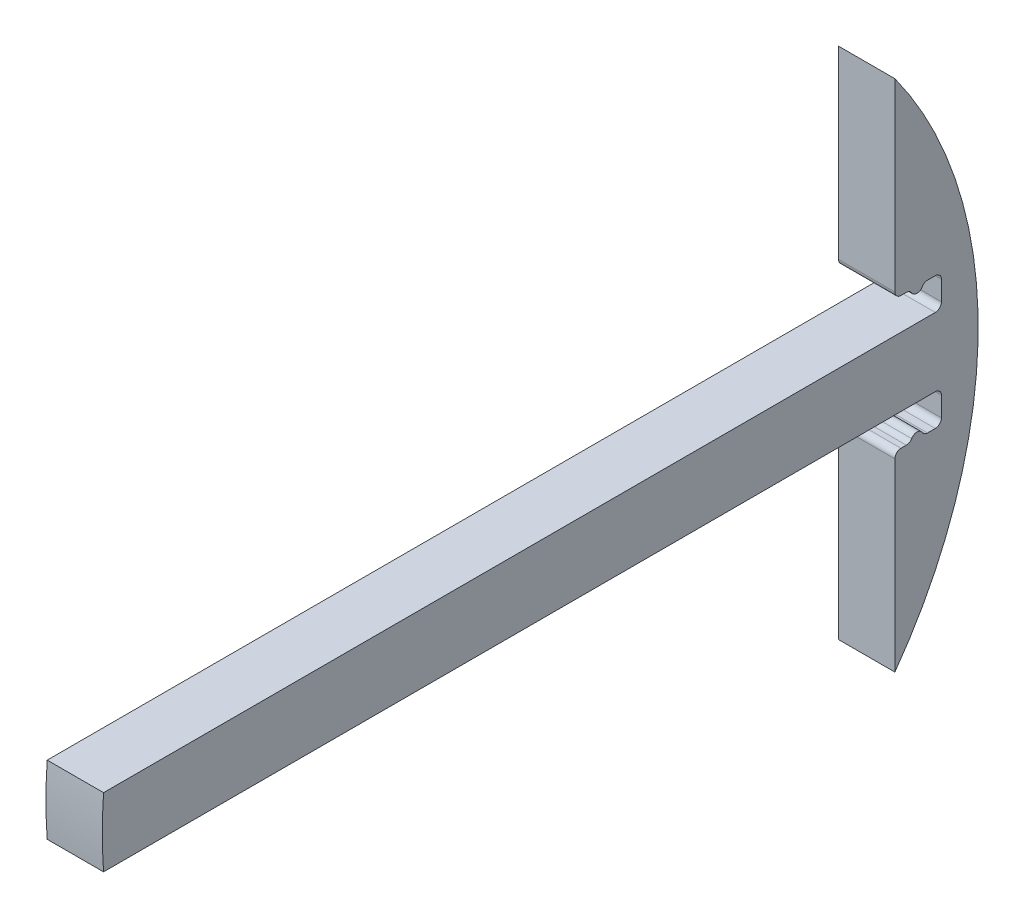
ISO-10303-21;
HEADER;
FILE_DESCRIPTION(('STEP AP214'),'2;1');
FILE_NAME('part.step','',(''),(''),'','','');
FILE_SCHEMA(('AUTOMOTIVE_DESIGN { 1 0 10303 214 1 1 1 1 }'));
ENDSEC;
DATA;
#1=APPLICATION_CONTEXT('core data for automotive mechanical design processes');
#2=APPLICATION_PROTOCOL_DEFINITION('international standard','automotive_design',2000,#1);
#3=PRODUCT_CONTEXT('',#1,'mechanical');
#4=PRODUCT('Part','Part','',(#3));
#5=PRODUCT_RELATED_PRODUCT_CATEGORY('part','',(#4));
#6=PRODUCT_DEFINITION_FORMATION('','',#4);
#7=PRODUCT_DEFINITION_CONTEXT('part definition',#1,'design');
#8=PRODUCT_DEFINITION('design','',#6,#7);
#9=PRODUCT_DEFINITION_SHAPE('','',#8);
#10=(LENGTH_UNIT() NAMED_UNIT(*) SI_UNIT(.MILLI.,.METRE.));
#11=(NAMED_UNIT(*) PLANE_ANGLE_UNIT() SI_UNIT($,.RADIAN.));
#12=(NAMED_UNIT(*) SI_UNIT($,.STERADIAN.) SOLID_ANGLE_UNIT());
#13=UNCERTAINTY_MEASURE_WITH_UNIT(LENGTH_MEASURE(1.E-05),#10,'distance_accuracy_value','');
#14=(GEOMETRIC_REPRESENTATION_CONTEXT(3) GLOBAL_UNCERTAINTY_ASSIGNED_CONTEXT((#13)) GLOBAL_UNIT_ASSIGNED_CONTEXT((#10,
#11,#12)) REPRESENTATION_CONTEXT('',''));
#15=CARTESIAN_POINT('',(0.,0.,0.));
#16=DIRECTION('',(0.,0.,1.));
#17=DIRECTION('',(1.,0.,0.));
#18=AXIS2_PLACEMENT_3D('',#15,#16,#17);
#19=CARTESIAN_POINT('',(4.6,0.,0.));
#20=DIRECTION('',(-1.,0.,0.));
#21=DIRECTION('',(0.,0.,1.));
#22=AXIS2_PLACEMENT_3D('',#19,#20,#21);
#23=CYLINDRICAL_SURFACE('',#22,35.75);
#24=DIRECTION('',(1.,0.,0.));
#25=VECTOR('',#24,1.);
#26=CARTESIAN_POINT('',(0.,20.9752234791432,-28.95));
#27=LINE('',#26,#25);
#28=CARTESIAN_POINT('',(0.,20.9752234791432,-28.95));
#29=VERTEX_POINT('',#28);
#30=CARTESIAN_POINT('',(4.6,20.9752234791432,-28.95));
#31=VERTEX_POINT('',#30);
#32=EDGE_CURVE('E203',#29,#31,#27,.T.);
#33=ORIENTED_EDGE('',*,*,#32,.T.);
#34=CARTESIAN_POINT('',(4.6,0.,0.));
#35=DIRECTION('',(1.,0.,0.));
#36=DIRECTION('',(0.,0.,-1.));
#37=AXIS2_PLACEMENT_3D('',#34,#35,#36);
#38=CIRCLE('',#37,35.75);
#39=CARTESIAN_POINT('',(4.6,-20.9752234791432,-28.95));
#40=VERTEX_POINT('',#39);
#41=EDGE_CURVE('E233',#40,#31,#38,.T.);
#42=ORIENTED_EDGE('',*,*,#41,.F.);
#43=DIRECTION('',(1.,0.,0.));
#44=VECTOR('',#43,1.);
#45=CARTESIAN_POINT('',(0.,-20.9752234791432,-28.95));
#46=LINE('',#45,#44);
#47=CARTESIAN_POINT('',(0.,-20.9752234791432,-28.95));
#48=VERTEX_POINT('',#47);
#49=EDGE_CURVE('E229',#48,#40,#46,.T.);
#50=ORIENTED_EDGE('',*,*,#49,.F.);
#51=CARTESIAN_POINT('',(0.,0.,0.));
#52=DIRECTION('',(1.,0.,0.));
#53=DIRECTION('',(0.,0.,-1.));
#54=AXIS2_PLACEMENT_3D('',#51,#52,#53);
#55=CIRCLE('',#54,35.75);
#56=EDGE_CURVE('E221',#48,#29,#55,.T.);
#57=ORIENTED_EDGE('',*,*,#56,.T.);
#58=EDGE_LOOP('',(#33,#42,#50,#57));
#59=FACE_BOUND('',#58,.T.);
#60=ADVANCED_FACE('F43',(#59),#23,.T.);
#61=DIRECTION('',(1.,0.,0.));
#62=VECTOR('',#61,1.);
#63=CARTESIAN_POINT('',(0.,2.79999999999999,35.6401809759715));
#64=LINE('',#63,#62);
#65=CARTESIAN_POINT('',(0.,2.79999999999999,35.6401809759715));
#66=VERTEX_POINT('',#65);
#67=CARTESIAN_POINT('',(4.6,2.79999999999999,35.6401809759715));
#68=VERTEX_POINT('',#67);
#69=EDGE_CURVE('E215',#66,#68,#64,.T.);
#70=ORIENTED_EDGE('',*,*,#69,.F.);
#71=CARTESIAN_POINT('',(0.,-2.8,35.6401809759715));
#72=VERTEX_POINT('',#71);
#73=EDGE_CURVE('E230',#66,#72,#55,.T.);
#74=ORIENTED_EDGE('',*,*,#73,.T.);
#75=DIRECTION('',(1.,0.,0.));
#76=VECTOR('',#75,1.);
#77=CARTESIAN_POINT('',(0.,-2.8,35.6401809759715));
#78=LINE('',#77,#76);
#79=CARTESIAN_POINT('',(4.6,-2.8,35.6401809759715));
#80=VERTEX_POINT('',#79);
#81=EDGE_CURVE('E374',#72,#80,#78,.T.);
#82=ORIENTED_EDGE('',*,*,#81,.T.);
#83=EDGE_CURVE('E243',#68,#80,#38,.T.);
#84=ORIENTED_EDGE('',*,*,#83,.F.);
#85=EDGE_LOOP('',(#70,#74,#82,#84));
#86=FACE_BOUND('',#85,.T.);
#87=ADVANCED_FACE('F364',(#86),#23,.T.);
#88=CARTESIAN_POINT('',(4.6,0.,0.));
#89=DIRECTION('',(1.,0.,0.));
#90=DIRECTION('',(0.,0.,-1.));
#91=AXIS2_PLACEMENT_3D('',#88,#89,#90);
#92=PLANE('',#91);
#93=CARTESIAN_POINT('',(4.6,-5.4,-30.75));
#94=DIRECTION('',(1.,0.,0.));
#95=DIRECTION('',(0.,0.,-1.));
#96=AXIS2_PLACEMENT_3D('',#93,#94,#95);
#97=CIRCLE('',#96,0.499999999999999);
#98=CARTESIAN_POINT('',(4.6,-5.15,-30.3169872981078));
#99=VERTEX_POINT('',#98);
#100=CARTESIAN_POINT('',(4.6,-5.15,-31.1830127018922));
#101=VERTEX_POINT('',#100);
#102=EDGE_CURVE('E386',#99,#101,#97,.F.);
#103=ORIENTED_EDGE('',*,*,#102,.F.);
#104=CARTESIAN_POINT('',(4.6,-4.9,-29.8839745962156));
#105=DIRECTION('',(1.,0.,0.));
#106=DIRECTION('',(0.,0.,-1.));
#107=AXIS2_PLACEMENT_3D('',#104,#105,#106);
#108=CIRCLE('',#107,0.5);
#109=CARTESIAN_POINT('',(4.6,-5.4,-29.8839745962156));
#110=VERTEX_POINT('',#109);
#111=EDGE_CURVE('E318',#99,#110,#108,.F.);
#112=ORIENTED_EDGE('',*,*,#111,.T.);
#113=DIRECTION('',(0.,0.,1.));
#114=VECTOR('',#113,1.);
#115=CARTESIAN_POINT('',(4.6,-5.39999999999999,0.));
#116=LINE('',#115,#114);
#117=CARTESIAN_POINT('',(4.6,-5.4,-29.45));
#118=VERTEX_POINT('',#117);
#119=EDGE_CURVE('E384',#110,#118,#116,.T.);
#120=ORIENTED_EDGE('',*,*,#119,.T.);
#121=CARTESIAN_POINT('',(4.6,-5.9,-29.45));
#122=DIRECTION('',(1.,0.,0.));
#123=DIRECTION('',(0.,0.,-1.));
#124=AXIS2_PLACEMENT_3D('',#121,#122,#123);
#125=CIRCLE('',#124,0.5);
#126=CARTESIAN_POINT('',(4.6,-5.9,-28.95));
#127=VERTEX_POINT('',#126);
#128=EDGE_CURVE('E246',#118,#127,#125,.T.);
#129=ORIENTED_EDGE('',*,*,#128,.T.);
#130=DIRECTION('',(0.,-1.,0.));
#131=VECTOR('',#130,1.);
#132=CARTESIAN_POINT('',(4.6,0.,-28.95));
#133=LINE('',#132,#131);
#134=EDGE_CURVE('E382',#127,#40,#133,.T.);
#135=ORIENTED_EDGE('',*,*,#134,.T.);
#136=ORIENTED_EDGE('',*,*,#41,.T.);
#137=DIRECTION('',(0.,-1.,0.));
#138=VECTOR('',#137,1.);
#139=CARTESIAN_POINT('',(4.6,0.,-28.95));
#140=LINE('',#139,#138);
#141=CARTESIAN_POINT('',(4.6,5.9,-28.95));
#142=VERTEX_POINT('',#141);
#143=EDGE_CURVE('E210',#31,#142,#140,.T.);
#144=ORIENTED_EDGE('',*,*,#143,.T.);
#145=CARTESIAN_POINT('',(4.6,5.9,-29.45));
#146=DIRECTION('',(1.,0.,0.));
#147=DIRECTION('',(0.,0.,-1.));
#148=AXIS2_PLACEMENT_3D('',#145,#146,#147);
#149=CIRCLE('',#148,0.5);
#150=CARTESIAN_POINT('',(4.6,5.4,-29.45));
#151=VERTEX_POINT('',#150);
#152=EDGE_CURVE('E242',#142,#151,#149,.T.);
#153=ORIENTED_EDGE('',*,*,#152,.T.);
#154=DIRECTION('',(0.,0.,1.));
#155=VECTOR('',#154,1.);
#156=CARTESIAN_POINT('',(4.6,5.39999999999999,0.));
#157=LINE('',#156,#155);
#158=CARTESIAN_POINT('',(4.6,5.4,-29.8839745962156));
#159=VERTEX_POINT('',#158);
#160=EDGE_CURVE('E225',#159,#151,#157,.T.);
#161=ORIENTED_EDGE('',*,*,#160,.F.);
#162=CARTESIAN_POINT('',(4.6,4.9,-29.8839745962156));
#163=DIRECTION('',(1.,0.,0.));
#164=DIRECTION('',(0.,0.,-1.));
#165=AXIS2_PLACEMENT_3D('',#162,#163,#164);
#166=CIRCLE('',#165,0.5);
#167=CARTESIAN_POINT('',(4.6,5.15,-30.3169872981078));
#168=VERTEX_POINT('',#167);
#169=EDGE_CURVE('E51',#159,#168,#166,.F.);
#170=ORIENTED_EDGE('',*,*,#169,.T.);
#171=CARTESIAN_POINT('',(4.6,5.4,-30.75));
#172=DIRECTION('',(1.,0.,0.));
#173=DIRECTION('',(0.,0.,-1.));
#174=AXIS2_PLACEMENT_3D('',#171,#172,#173);
#175=CIRCLE('',#174,0.499999999999999);
#176=CARTESIAN_POINT('',(4.6,5.15,-31.1830127018922));
#177=VERTEX_POINT('',#176);
#178=EDGE_CURVE('E331',#168,#177,#175,.T.);
#179=ORIENTED_EDGE('',*,*,#178,.T.);
#180=CARTESIAN_POINT('',(4.6,4.9,-31.6160254037844));
#181=DIRECTION('',(1.,0.,0.));
#182=DIRECTION('',(0.,0.,-1.));
#183=AXIS2_PLACEMENT_3D('',#180,#181,#182);
#184=CIRCLE('',#183,0.5);
#185=CARTESIAN_POINT('',(4.6,5.4,-31.6160254037844));
#186=VERTEX_POINT('',#185);
#187=EDGE_CURVE('E322',#177,#186,#184,.F.);
#188=ORIENTED_EDGE('',*,*,#187,.T.);
#189=CARTESIAN_POINT('',(4.6,5.4,-32.25));
#190=VERTEX_POINT('',#189);
#191=EDGE_CURVE('E336',#190,#186,#157,.T.);
#192=ORIENTED_EDGE('',*,*,#191,.F.);
#193=CARTESIAN_POINT('',(4.6,4.9,-32.25));
#194=DIRECTION('',(1.,0.,0.));
#195=DIRECTION('',(0.,0.,-1.));
#196=AXIS2_PLACEMENT_3D('',#193,#194,#195);
#197=CIRCLE('',#196,0.5);
#198=CARTESIAN_POINT('',(4.6,4.9,-32.75));
#199=VERTEX_POINT('',#198);
#200=EDGE_CURVE('E291',#190,#199,#197,.F.);
#201=ORIENTED_EDGE('',*,*,#200,.T.);
#202=DIRECTION('',(0.,1.,0.));
#203=VECTOR('',#202,1.);
#204=CARTESIAN_POINT('',(4.6,0.,-32.75));
#205=LINE('',#204,#203);
#206=CARTESIAN_POINT('',(4.6,3.3,-32.75));
#207=VERTEX_POINT('',#206);
#208=EDGE_CURVE('E401',#207,#199,#205,.T.);
#209=ORIENTED_EDGE('',*,*,#208,.F.);
#210=CARTESIAN_POINT('',(4.6,3.3,-32.25));
#211=DIRECTION('',(1.,0.,0.));
#212=DIRECTION('',(0.,0.,-1.));
#213=AXIS2_PLACEMENT_3D('',#210,#211,#212);
#214=CIRCLE('',#213,0.5);
#215=CARTESIAN_POINT('',(4.6,2.8,-32.25));
#216=VERTEX_POINT('',#215);
#217=EDGE_CURVE('E287',#207,#216,#214,.F.);
#218=ORIENTED_EDGE('',*,*,#217,.T.);
#219=DIRECTION('',(0.,0.,1.));
#220=VECTOR('',#219,1.);
#221=CARTESIAN_POINT('',(4.6,2.8,0.));
#222=LINE('',#221,#220);
#223=EDGE_CURVE('E399',#216,#68,#222,.T.);
#224=ORIENTED_EDGE('',*,*,#223,.T.);
#225=ORIENTED_EDGE('',*,*,#83,.T.);
#226=DIRECTION('',(0.,0.,-1.));
#227=VECTOR('',#226,1.);
#228=CARTESIAN_POINT('',(4.6,-2.8,0.));
#229=LINE('',#228,#227);
#230=CARTESIAN_POINT('',(4.6,-2.8,-32.25));
#231=VERTEX_POINT('',#230);
#232=EDGE_CURVE('E393',#80,#231,#229,.T.);
#233=ORIENTED_EDGE('',*,*,#232,.T.);
#234=CARTESIAN_POINT('',(4.6,-3.3,-32.25));
#235=DIRECTION('',(1.,0.,0.));
#236=DIRECTION('',(0.,0.,-1.));
#237=AXIS2_PLACEMENT_3D('',#234,#235,#236);
#238=CIRCLE('',#237,0.5);
#239=CARTESIAN_POINT('',(4.6,-3.3,-32.75));
#240=VERTEX_POINT('',#239);
#241=EDGE_CURVE('E279',#231,#240,#238,.F.);
#242=ORIENTED_EDGE('',*,*,#241,.T.);
#243=DIRECTION('',(0.,-1.,0.));
#244=VECTOR('',#243,1.);
#245=CARTESIAN_POINT('',(4.6,0.,-32.75));
#246=LINE('',#245,#244);
#247=CARTESIAN_POINT('',(4.6,-4.9,-32.75));
#248=VERTEX_POINT('',#247);
#249=EDGE_CURVE('E390',#240,#248,#246,.T.);
#250=ORIENTED_EDGE('',*,*,#249,.T.);
#251=CARTESIAN_POINT('',(4.6,-4.9,-32.25));
#252=DIRECTION('',(1.,0.,0.));
#253=DIRECTION('',(0.,0.,-1.));
#254=AXIS2_PLACEMENT_3D('',#251,#252,#253);
#255=CIRCLE('',#254,0.5);
#256=CARTESIAN_POINT('',(4.6,-5.4,-32.25));
#257=VERTEX_POINT('',#256);
#258=EDGE_CURVE('E283',#248,#257,#255,.F.);
#259=ORIENTED_EDGE('',*,*,#258,.T.);
#260=CARTESIAN_POINT('',(4.6,-5.4,-31.6160254037844));
#261=VERTEX_POINT('',#260);
#262=EDGE_CURVE('E387',#257,#261,#116,.T.);
#263=ORIENTED_EDGE('',*,*,#262,.T.);
#264=CARTESIAN_POINT('',(4.6,-4.9,-31.6160254037844));
#265=DIRECTION('',(1.,0.,0.));
#266=DIRECTION('',(0.,0.,-1.));
#267=AXIS2_PLACEMENT_3D('',#264,#265,#266);
#268=CIRCLE('',#267,0.5);
#269=EDGE_CURVE('E314',#261,#101,#268,.F.);
#270=ORIENTED_EDGE('',*,*,#269,.T.);
#271=EDGE_LOOP('',(#103,#112,#120,#129,#135,#136,#144,#153,#161,#170,#179,#188,#192,#201,#209,
#218,#224,#225,#233,#242,#250,#259,#263,#270));
#272=FACE_BOUND('',#271,.T.);
#273=ADVANCED_FACE('F330',(#272),#92,.T.);
#274=CARTESIAN_POINT('',(0.,0.,0.));
#275=DIRECTION('',(1.,0.,0.));
#276=DIRECTION('',(0.,0.,-1.));
#277=AXIS2_PLACEMENT_3D('',#274,#275,#276);
#278=PLANE('',#277);
#279=DIRECTION('',(0.,-1.,0.));
#280=VECTOR('',#279,1.);
#281=CARTESIAN_POINT('',(0.,0.,-28.95));
#282=LINE('',#281,#280);
#283=CARTESIAN_POINT('',(0.,-5.9,-28.95));
#284=VERTEX_POINT('',#283);
#285=EDGE_CURVE('E396',#284,#48,#282,.T.);
#286=ORIENTED_EDGE('',*,*,#285,.F.);
#287=CARTESIAN_POINT('',(0.,-5.9,-29.45));
#288=DIRECTION('',(1.,0.,0.));
#289=DIRECTION('',(0.,0.,-1.));
#290=AXIS2_PLACEMENT_3D('',#287,#288,#289);
#291=CIRCLE('',#290,0.5);
#292=CARTESIAN_POINT('',(0.,-5.4,-29.45));
#293=VERTEX_POINT('',#292);
#294=EDGE_CURVE('E251',#284,#293,#291,.F.);
#295=ORIENTED_EDGE('',*,*,#294,.T.);
#296=DIRECTION('',(0.,0.,1.));
#297=VECTOR('',#296,1.);
#298=CARTESIAN_POINT('',(0.,-5.39999999999999,0.));
#299=LINE('',#298,#297);
#300=CARTESIAN_POINT('',(0.,-5.4,-29.8839745962156));
#301=VERTEX_POINT('',#300);
#302=EDGE_CURVE('E409',#301,#293,#299,.T.);
#303=ORIENTED_EDGE('',*,*,#302,.F.);
#304=CARTESIAN_POINT('',(0.,-4.9,-29.8839745962156));
#305=DIRECTION('',(1.,0.,0.));
#306=DIRECTION('',(0.,0.,-1.));
#307=AXIS2_PLACEMENT_3D('',#304,#305,#306);
#308=CIRCLE('',#307,0.5);
#309=CARTESIAN_POINT('',(0.,-5.15,-30.3169872981078));
#310=VERTEX_POINT('',#309);
#311=EDGE_CURVE('E320',#301,#310,#308,.T.);
#312=ORIENTED_EDGE('',*,*,#311,.T.);
#313=CARTESIAN_POINT('',(0.,-5.4,-30.75));
#314=DIRECTION('',(1.,0.,0.));
#315=DIRECTION('',(0.,0.,-1.));
#316=AXIS2_PLACEMENT_3D('',#313,#314,#315);
#317=CIRCLE('',#316,0.499999999999999);
#318=CARTESIAN_POINT('',(0.,-5.15,-31.1830127018922));
#319=VERTEX_POINT('',#318);
#320=EDGE_CURVE('E410',#310,#319,#317,.F.);
#321=ORIENTED_EDGE('',*,*,#320,.T.);
#322=CARTESIAN_POINT('',(0.,-4.9,-31.6160254037844));
#323=DIRECTION('',(1.,0.,0.));
#324=DIRECTION('',(0.,0.,-1.));
#325=AXIS2_PLACEMENT_3D('',#322,#323,#324);
#326=CIRCLE('',#325,0.5);
#327=CARTESIAN_POINT('',(0.,-5.4,-31.6160254037844));
#328=VERTEX_POINT('',#327);
#329=EDGE_CURVE('E316',#319,#328,#326,.T.);
#330=ORIENTED_EDGE('',*,*,#329,.T.);
#331=CARTESIAN_POINT('',(0.,-5.4,-32.25));
#332=VERTEX_POINT('',#331);
#333=EDGE_CURVE('E378',#332,#328,#299,.T.);
#334=ORIENTED_EDGE('',*,*,#333,.F.);
#335=CARTESIAN_POINT('',(0.,-4.9,-32.25));
#336=DIRECTION('',(1.,0.,0.));
#337=DIRECTION('',(0.,0.,-1.));
#338=AXIS2_PLACEMENT_3D('',#335,#336,#337);
#339=CIRCLE('',#338,0.5);
#340=CARTESIAN_POINT('',(0.,-4.9,-32.75));
#341=VERTEX_POINT('',#340);
#342=EDGE_CURVE('E285',#332,#341,#339,.T.);
#343=ORIENTED_EDGE('',*,*,#342,.T.);
#344=DIRECTION('',(0.,-1.,0.));
#345=VECTOR('',#344,1.);
#346=CARTESIAN_POINT('',(0.,0.,-32.75));
#347=LINE('',#346,#345);
#348=CARTESIAN_POINT('',(0.,-3.3,-32.75));
#349=VERTEX_POINT('',#348);
#350=EDGE_CURVE('E375',#349,#341,#347,.T.);
#351=ORIENTED_EDGE('',*,*,#350,.F.);
#352=CARTESIAN_POINT('',(0.,-3.3,-32.25));
#353=DIRECTION('',(1.,0.,0.));
#354=DIRECTION('',(0.,0.,-1.));
#355=AXIS2_PLACEMENT_3D('',#352,#353,#354);
#356=CIRCLE('',#355,0.5);
#357=CARTESIAN_POINT('',(0.,-2.8,-32.25));
#358=VERTEX_POINT('',#357);
#359=EDGE_CURVE('E281',#349,#358,#356,.T.);
#360=ORIENTED_EDGE('',*,*,#359,.T.);
#361=DIRECTION('',(0.,0.,-1.));
#362=VECTOR('',#361,1.);
#363=CARTESIAN_POINT('',(0.,-2.8,0.));
#364=LINE('',#363,#362);
#365=EDGE_CURVE('E369',#72,#358,#364,.T.);
#366=ORIENTED_EDGE('',*,*,#365,.F.);
#367=ORIENTED_EDGE('',*,*,#73,.F.);
#368=DIRECTION('',(0.,0.,1.));
#369=VECTOR('',#368,1.);
#370=CARTESIAN_POINT('',(0.,2.8,0.));
#371=LINE('',#370,#369);
#372=CARTESIAN_POINT('',(0.,2.8,-32.25));
#373=VERTEX_POINT('',#372);
#374=EDGE_CURVE('E224',#373,#66,#371,.T.);
#375=ORIENTED_EDGE('',*,*,#374,.F.);
#376=CARTESIAN_POINT('',(0.,3.3,-32.25));
#377=DIRECTION('',(1.,0.,0.));
#378=DIRECTION('',(0.,0.,-1.));
#379=AXIS2_PLACEMENT_3D('',#376,#377,#378);
#380=CIRCLE('',#379,0.5);
#381=CARTESIAN_POINT('',(0.,3.3,-32.75));
#382=VERTEX_POINT('',#381);
#383=EDGE_CURVE('E289',#373,#382,#380,.T.);
#384=ORIENTED_EDGE('',*,*,#383,.T.);
#385=DIRECTION('',(0.,1.,0.));
#386=VECTOR('',#385,1.);
#387=CARTESIAN_POINT('',(0.,0.,-32.75));
#388=LINE('',#387,#386);
#389=CARTESIAN_POINT('',(0.,4.9,-32.75));
#390=VERTEX_POINT('',#389);
#391=EDGE_CURVE('E347',#382,#390,#388,.T.);
#392=ORIENTED_EDGE('',*,*,#391,.T.);
#393=CARTESIAN_POINT('',(0.,4.9,-32.25));
#394=DIRECTION('',(1.,0.,0.));
#395=DIRECTION('',(0.,0.,-1.));
#396=AXIS2_PLACEMENT_3D('',#393,#394,#395);
#397=CIRCLE('',#396,0.5);
#398=CARTESIAN_POINT('',(0.,5.4,-32.25));
#399=VERTEX_POINT('',#398);
#400=EDGE_CURVE('E293',#390,#399,#397,.T.);
#401=ORIENTED_EDGE('',*,*,#400,.T.);
#402=DIRECTION('',(0.,0.,1.));
#403=VECTOR('',#402,1.);
#404=CARTESIAN_POINT('',(0.,5.39999999999999,0.));
#405=LINE('',#404,#403);
#406=CARTESIAN_POINT('',(0.,5.4,-31.6160254037844));
#407=VERTEX_POINT('',#406);
#408=EDGE_CURVE('E343',#399,#407,#405,.T.);
#409=ORIENTED_EDGE('',*,*,#408,.T.);
#410=CARTESIAN_POINT('',(0.,4.9,-31.6160254037844));
#411=DIRECTION('',(1.,0.,0.));
#412=DIRECTION('',(0.,0.,-1.));
#413=AXIS2_PLACEMENT_3D('',#410,#411,#412);
#414=CIRCLE('',#413,0.5);
#415=CARTESIAN_POINT('',(0.,5.15,-31.1830127018922));
#416=VERTEX_POINT('',#415);
#417=EDGE_CURVE('E324',#407,#416,#414,.T.);
#418=ORIENTED_EDGE('',*,*,#417,.T.);
#419=CARTESIAN_POINT('',(0.,5.4,-30.75));
#420=DIRECTION('',(1.,0.,0.));
#421=DIRECTION('',(0.,0.,-1.));
#422=AXIS2_PLACEMENT_3D('',#419,#420,#421);
#423=CIRCLE('',#422,0.499999999999999);
#424=CARTESIAN_POINT('',(0.,5.15,-30.3169872981078));
#425=VERTEX_POINT('',#424);
#426=EDGE_CURVE('E341',#425,#416,#423,.T.);
#427=ORIENTED_EDGE('',*,*,#426,.F.);
#428=CARTESIAN_POINT('',(0.,4.9,-29.8839745962156));
#429=DIRECTION('',(1.,0.,0.));
#430=DIRECTION('',(0.,0.,-1.));
#431=AXIS2_PLACEMENT_3D('',#428,#429,#430);
#432=CIRCLE('',#431,0.5);
#433=CARTESIAN_POINT('',(0.,5.4,-29.8839745962156));
#434=VERTEX_POINT('',#433);
#435=EDGE_CURVE('E11',#425,#434,#432,.T.);
#436=ORIENTED_EDGE('',*,*,#435,.T.);
#437=CARTESIAN_POINT('',(0.,5.4,-29.45));
#438=VERTEX_POINT('',#437);
#439=EDGE_CURVE('E216',#434,#438,#405,.T.);
#440=ORIENTED_EDGE('',*,*,#439,.T.);
#441=CARTESIAN_POINT('',(0.,5.9,-29.45));
#442=DIRECTION('',(1.,0.,0.));
#443=DIRECTION('',(0.,0.,-1.));
#444=AXIS2_PLACEMENT_3D('',#441,#442,#443);
#445=CIRCLE('',#444,0.5);
#446=CARTESIAN_POINT('',(0.,5.9,-28.95));
#447=VERTEX_POINT('',#446);
#448=EDGE_CURVE('E223',#438,#447,#445,.F.);
#449=ORIENTED_EDGE('',*,*,#448,.T.);
#450=DIRECTION('',(0.,-1.,0.));
#451=VECTOR('',#450,1.);
#452=CARTESIAN_POINT('',(0.,0.,-28.95));
#453=LINE('',#452,#451);
#454=EDGE_CURVE('E207',#29,#447,#453,.T.);
#455=ORIENTED_EDGE('',*,*,#454,.F.);
#456=ORIENTED_EDGE('',*,*,#56,.F.);
#457=EDGE_LOOP('',(#286,#295,#303,#312,#321,#330,#334,#343,#351,#360,#366,#367,#375,#384,#392,
#401,#409,#418,#427,#436,#440,#449,#455,#456));
#458=FACE_BOUND('',#457,.T.);
#459=ADVANCED_FACE('F220',(#458),#278,.F.);
#460=CARTESIAN_POINT('',(0.,0.,-28.95));
#461=DIRECTION('',(0.,0.,1.));
#462=DIRECTION('',(1.,0.,0.));
#463=AXIS2_PLACEMENT_3D('',#460,#461,#462);
#464=PLANE('',#463);
#465=ORIENTED_EDGE('',*,*,#134,.F.);
#466=DIRECTION('',(1.,0.,0.));
#467=VECTOR('',#466,1.);
#468=CARTESIAN_POINT('',(0.,-5.9,-28.95));
#469=LINE('',#468,#467);
#470=EDGE_CURVE('E248',#127,#284,#469,.F.);
#471=ORIENTED_EDGE('',*,*,#470,.T.);
#472=ORIENTED_EDGE('',*,*,#285,.T.);
#473=ORIENTED_EDGE('',*,*,#49,.T.);
#474=EDGE_LOOP('',(#465,#471,#472,#473));
#475=FACE_BOUND('',#474,.T.);
#476=ADVANCED_FACE('F443',(#475),#464,.T.);
#477=CARTESIAN_POINT('',(0.,-2.8,0.));
#478=DIRECTION('',(0.,-1.,0.));
#479=DIRECTION('',(0.,0.,-1.));
#480=AXIS2_PLACEMENT_3D('',#477,#478,#479);
#481=PLANE('',#480);
#482=ORIENTED_EDGE('',*,*,#365,.T.);
#483=DIRECTION('',(1.,0.,0.));
#484=VECTOR('',#483,1.);
#485=CARTESIAN_POINT('',(4.6,-2.8,-32.25));
#486=LINE('',#485,#484);
#487=EDGE_CURVE('E254',#358,#231,#486,.T.);
#488=ORIENTED_EDGE('',*,*,#487,.T.);
#489=ORIENTED_EDGE('',*,*,#232,.F.);
#490=ORIENTED_EDGE('',*,*,#81,.F.);
#491=EDGE_LOOP('',(#482,#488,#489,#490));
#492=FACE_BOUND('',#491,.T.);
#493=ADVANCED_FACE('F445',(#492),#481,.T.);
#494=CARTESIAN_POINT('',(0.,0.,-32.75));
#495=DIRECTION('',(0.,0.,1.));
#496=DIRECTION('',(1.,0.,0.));
#497=AXIS2_PLACEMENT_3D('',#494,#495,#496);
#498=PLANE('',#497);
#499=ORIENTED_EDGE('',*,*,#249,.F.);
#500=DIRECTION('',(1.,0.,0.));
#501=VECTOR('',#500,1.);
#502=CARTESIAN_POINT('',(0.,-3.3,-32.75));
#503=LINE('',#502,#501);
#504=EDGE_CURVE('E260',#240,#349,#503,.F.);
#505=ORIENTED_EDGE('',*,*,#504,.T.);
#506=ORIENTED_EDGE('',*,*,#350,.T.);
#507=DIRECTION('',(1.,0.,0.));
#508=VECTOR('',#507,1.);
#509=CARTESIAN_POINT('',(4.6,-4.9,-32.75));
#510=LINE('',#509,#508);
#511=EDGE_CURVE('E257',#341,#248,#510,.T.);
#512=ORIENTED_EDGE('',*,*,#511,.T.);
#513=EDGE_LOOP('',(#499,#505,#506,#512));
#514=FACE_BOUND('',#513,.T.);
#515=ADVANCED_FACE('F451',(#514),#498,.T.);
#516=CARTESIAN_POINT('',(0.,-5.39999999999999,0.));
#517=DIRECTION('',(0.,1.,0.));
#518=DIRECTION('',(0.,0.,1.));
#519=AXIS2_PLACEMENT_3D('',#516,#517,#518);
#520=PLANE('',#519);
#521=ORIENTED_EDGE('',*,*,#333,.T.);
#522=DIRECTION('',(1.,0.,0.));
#523=VECTOR('',#522,1.);
#524=CARTESIAN_POINT('',(0.,-5.4,-31.6160254037844));
#525=LINE('',#524,#523);
#526=EDGE_CURVE('E295',#328,#261,#525,.T.);
#527=ORIENTED_EDGE('',*,*,#526,.T.);
#528=ORIENTED_EDGE('',*,*,#262,.F.);
#529=DIRECTION('',(1.,0.,0.));
#530=VECTOR('',#529,1.);
#531=CARTESIAN_POINT('',(0.,-5.4,-32.25));
#532=LINE('',#531,#530);
#533=EDGE_CURVE('E262',#257,#332,#532,.F.);
#534=ORIENTED_EDGE('',*,*,#533,.T.);
#535=EDGE_LOOP('',(#521,#527,#528,#534));
#536=FACE_BOUND('',#535,.T.);
#537=ADVANCED_FACE('F418',(#536),#520,.T.);
#538=CARTESIAN_POINT('',(0.,-5.4,-30.75));
#539=DIRECTION('',(1.,0.,0.));
#540=DIRECTION('',(0.,0.,-1.));
#541=AXIS2_PLACEMENT_3D('',#538,#539,#540);
#542=CYLINDRICAL_SURFACE('',#541,0.499999999999999);
#543=ORIENTED_EDGE('',*,*,#102,.T.);
#544=DIRECTION('',(1.,0.,0.));
#545=VECTOR('',#544,1.);
#546=CARTESIAN_POINT('',(0.,-5.15,-31.1830127018922));
#547=LINE('',#546,#545);
#548=EDGE_CURVE('E301',#101,#319,#547,.F.);
#549=ORIENTED_EDGE('',*,*,#548,.T.);
#550=ORIENTED_EDGE('',*,*,#320,.F.);
#551=DIRECTION('',(1.,0.,0.));
#552=VECTOR('',#551,1.);
#553=CARTESIAN_POINT('',(0.,-5.15,-30.3169872981078));
#554=LINE('',#553,#552);
#555=EDGE_CURVE('E298',#310,#99,#554,.T.);
#556=ORIENTED_EDGE('',*,*,#555,.T.);
#557=EDGE_LOOP('',(#543,#549,#550,#556));
#558=FACE_BOUND('',#557,.T.);
#559=ADVANCED_FACE('F427',(#558),#542,.T.);
#560=ORIENTED_EDGE('',*,*,#119,.F.);
#561=DIRECTION('',(1.,0.,0.));
#562=VECTOR('',#561,1.);
#563=CARTESIAN_POINT('',(0.,-5.4,-29.8839745962156));
#564=LINE('',#563,#562);
#565=EDGE_CURVE('E303',#110,#301,#564,.F.);
#566=ORIENTED_EDGE('',*,*,#565,.T.);
#567=ORIENTED_EDGE('',*,*,#302,.T.);
#568=DIRECTION('',(1.,0.,0.));
#569=VECTOR('',#568,1.);
#570=CARTESIAN_POINT('',(0.,-5.4,-29.45));
#571=LINE('',#570,#569);
#572=EDGE_CURVE('E239',#293,#118,#571,.T.);
#573=ORIENTED_EDGE('',*,*,#572,.T.);
#574=EDGE_LOOP('',(#560,#566,#567,#573));
#575=FACE_BOUND('',#574,.T.);
#576=ADVANCED_FACE('F436',(#575),#520,.T.);
#577=CARTESIAN_POINT('',(0.,0.,-28.95));
#578=DIRECTION('',(0.,0.,1.));
#579=DIRECTION('',(1.,0.,0.));
#580=AXIS2_PLACEMENT_3D('',#577,#578,#579);
#581=PLANE('',#580);
#582=ORIENTED_EDGE('',*,*,#454,.T.);
#583=DIRECTION('',(1.,0.,0.));
#584=VECTOR('',#583,1.);
#585=CARTESIAN_POINT('',(4.6,5.9,-28.95));
#586=LINE('',#585,#584);
#587=EDGE_CURVE('E274',#447,#142,#586,.T.);
#588=ORIENTED_EDGE('',*,*,#587,.T.);
#589=ORIENTED_EDGE('',*,*,#143,.F.);
#590=ORIENTED_EDGE('',*,*,#32,.F.);
#591=EDGE_LOOP('',(#582,#588,#589,#590));
#592=FACE_BOUND('',#591,.T.);
#593=ADVANCED_FACE('F205',(#592),#581,.T.);
#594=CARTESIAN_POINT('',(0.,5.39999999999999,0.));
#595=DIRECTION('',(0.,1.,0.));
#596=DIRECTION('',(0.,0.,1.));
#597=AXIS2_PLACEMENT_3D('',#594,#595,#596);
#598=PLANE('',#597);
#599=ORIENTED_EDGE('',*,*,#439,.F.);
#600=DIRECTION('',(1.,0.,0.));
#601=VECTOR('',#600,1.);
#602=CARTESIAN_POINT('',(0.,5.4,-29.8839745962156));
#603=LINE('',#602,#601);
#604=EDGE_CURVE('E312',#434,#159,#603,.T.);
#605=ORIENTED_EDGE('',*,*,#604,.T.);
#606=ORIENTED_EDGE('',*,*,#160,.T.);
#607=DIRECTION('',(1.,0.,0.));
#608=VECTOR('',#607,1.);
#609=CARTESIAN_POINT('',(0.,5.4,-29.45));
#610=LINE('',#609,#608);
#611=EDGE_CURVE('E276',#151,#438,#610,.F.);
#612=ORIENTED_EDGE('',*,*,#611,.T.);
#613=EDGE_LOOP('',(#599,#605,#606,#612));
#614=FACE_BOUND('',#613,.T.);
#615=ADVANCED_FACE('F339',(#614),#598,.F.);
#616=CARTESIAN_POINT('',(0.,5.4,-30.75));
#617=DIRECTION('',(1.,0.,0.));
#618=DIRECTION('',(0.,0.,-1.));
#619=AXIS2_PLACEMENT_3D('',#616,#617,#618);
#620=CYLINDRICAL_SURFACE('',#619,0.499999999999999);
#621=ORIENTED_EDGE('',*,*,#426,.T.);
#622=DIRECTION('',(1.,0.,0.));
#623=VECTOR('',#622,1.);
#624=CARTESIAN_POINT('',(0.,5.15,-31.1830127018922));
#625=LINE('',#624,#623);
#626=EDGE_CURVE('E307',#416,#177,#625,.T.);
#627=ORIENTED_EDGE('',*,*,#626,.T.);
#628=ORIENTED_EDGE('',*,*,#178,.F.);
#629=DIRECTION('',(1.,0.,0.));
#630=VECTOR('',#629,1.);
#631=CARTESIAN_POINT('',(0.,5.15,-30.3169872981078));
#632=LINE('',#631,#630);
#633=EDGE_CURVE('E305',#168,#425,#632,.F.);
#634=ORIENTED_EDGE('',*,*,#633,.T.);
#635=EDGE_LOOP('',(#621,#627,#628,#634));
#636=FACE_BOUND('',#635,.T.);
#637=ADVANCED_FACE('F334',(#636),#620,.T.);
#638=ORIENTED_EDGE('',*,*,#191,.T.);
#639=DIRECTION('',(1.,0.,0.));
#640=VECTOR('',#639,1.);
#641=CARTESIAN_POINT('',(0.,5.4,-31.6160254037844));
#642=LINE('',#641,#640);
#643=EDGE_CURVE('E310',#186,#407,#642,.F.);
#644=ORIENTED_EDGE('',*,*,#643,.T.);
#645=ORIENTED_EDGE('',*,*,#408,.F.);
#646=DIRECTION('',(1.,0.,0.));
#647=VECTOR('',#646,1.);
#648=CARTESIAN_POINT('',(4.6,5.4,-32.25));
#649=LINE('',#648,#647);
#650=EDGE_CURVE('E271',#399,#190,#649,.T.);
#651=ORIENTED_EDGE('',*,*,#650,.T.);
#652=EDGE_LOOP('',(#638,#644,#645,#651));
#653=FACE_BOUND('',#652,.T.);
#654=ADVANCED_FACE('F496',(#653),#598,.F.);
#655=CARTESIAN_POINT('',(0.,0.,-32.75));
#656=DIRECTION('',(0.,0.,-1.));
#657=DIRECTION('',(-1.,0.,0.));
#658=AXIS2_PLACEMENT_3D('',#655,#656,#657);
#659=PLANE('',#658);
#660=ORIENTED_EDGE('',*,*,#391,.F.);
#661=DIRECTION('',(1.,0.,0.));
#662=VECTOR('',#661,1.);
#663=CARTESIAN_POINT('',(0.,3.3,-32.75));
#664=LINE('',#663,#662);
#665=EDGE_CURVE('E266',#382,#207,#664,.T.);
#666=ORIENTED_EDGE('',*,*,#665,.T.);
#667=ORIENTED_EDGE('',*,*,#208,.T.);
#668=DIRECTION('',(1.,0.,0.));
#669=VECTOR('',#668,1.);
#670=CARTESIAN_POINT('',(0.,4.9,-32.75));
#671=LINE('',#670,#669);
#672=EDGE_CURVE('E264',#199,#390,#671,.F.);
#673=ORIENTED_EDGE('',*,*,#672,.T.);
#674=EDGE_LOOP('',(#660,#666,#667,#673));
#675=FACE_BOUND('',#674,.T.);
#676=ADVANCED_FACE('F501',(#675),#659,.F.);
#677=CARTESIAN_POINT('',(0.,2.8,0.));
#678=DIRECTION('',(0.,1.,0.));
#679=DIRECTION('',(0.,0.,1.));
#680=AXIS2_PLACEMENT_3D('',#677,#678,#679);
#681=PLANE('',#680);
#682=ORIENTED_EDGE('',*,*,#223,.F.);
#683=DIRECTION('',(1.,0.,0.));
#684=VECTOR('',#683,1.);
#685=CARTESIAN_POINT('',(0.,2.8,-32.25));
#686=LINE('',#685,#684);
#687=EDGE_CURVE('E269',#216,#373,#686,.F.);
#688=ORIENTED_EDGE('',*,*,#687,.T.);
#689=ORIENTED_EDGE('',*,*,#374,.T.);
#690=ORIENTED_EDGE('',*,*,#69,.T.);
#691=EDGE_LOOP('',(#682,#688,#689,#690));
#692=FACE_BOUND('',#691,.T.);
#693=ADVANCED_FACE('F358',(#692),#681,.T.);
#694=CARTESIAN_POINT('',(0.,-5.9,-29.45));
#695=DIRECTION('',(1.,0.,0.));
#696=DIRECTION('',(0.,0.,-1.));
#697=AXIS2_PLACEMENT_3D('',#694,#695,#696);
#698=CYLINDRICAL_SURFACE('',#697,0.5);
#699=ORIENTED_EDGE('',*,*,#294,.F.);
#700=ORIENTED_EDGE('',*,*,#470,.F.);
#701=ORIENTED_EDGE('',*,*,#128,.F.);
#702=ORIENTED_EDGE('',*,*,#572,.F.);
#703=EDGE_LOOP('',(#699,#700,#701,#702));
#704=FACE_BOUND('',#703,.T.);
#705=ADVANCED_FACE('F441',(#704),#698,.T.);
#706=CARTESIAN_POINT('',(0.,-3.3,-32.25));
#707=DIRECTION('',(-1.,0.,0.));
#708=DIRECTION('',(0.,0.,1.));
#709=AXIS2_PLACEMENT_3D('',#706,#707,#708);
#710=CYLINDRICAL_SURFACE('',#709,0.5);
#711=ORIENTED_EDGE('',*,*,#359,.F.);
#712=ORIENTED_EDGE('',*,*,#504,.F.);
#713=ORIENTED_EDGE('',*,*,#241,.F.);
#714=ORIENTED_EDGE('',*,*,#487,.F.);
#715=EDGE_LOOP('',(#711,#712,#713,#714));
#716=FACE_BOUND('',#715,.T.);
#717=ADVANCED_FACE('F464',(#716),#710,.F.);
#718=CARTESIAN_POINT('',(0.,-4.9,-32.25));
#719=DIRECTION('',(-1.,0.,0.));
#720=DIRECTION('',(0.,0.,1.));
#721=AXIS2_PLACEMENT_3D('',#718,#719,#720);
#722=CYLINDRICAL_SURFACE('',#721,0.5);
#723=ORIENTED_EDGE('',*,*,#342,.F.);
#724=ORIENTED_EDGE('',*,*,#533,.F.);
#725=ORIENTED_EDGE('',*,*,#258,.F.);
#726=ORIENTED_EDGE('',*,*,#511,.F.);
#727=EDGE_LOOP('',(#723,#724,#725,#726));
#728=FACE_BOUND('',#727,.T.);
#729=ADVANCED_FACE('F467',(#728),#722,.F.);
#730=CARTESIAN_POINT('',(0.,3.3,-32.25));
#731=DIRECTION('',(1.,0.,0.));
#732=DIRECTION('',(0.,0.,-1.));
#733=AXIS2_PLACEMENT_3D('',#730,#731,#732);
#734=CYLINDRICAL_SURFACE('',#733,0.5);
#735=ORIENTED_EDGE('',*,*,#383,.F.);
#736=ORIENTED_EDGE('',*,*,#687,.F.);
#737=ORIENTED_EDGE('',*,*,#217,.F.);
#738=ORIENTED_EDGE('',*,*,#665,.F.);
#739=EDGE_LOOP('',(#735,#736,#737,#738));
#740=FACE_BOUND('',#739,.T.);
#741=ADVANCED_FACE('F471',(#740),#734,.F.);
#742=CARTESIAN_POINT('',(0.,4.9,-32.25));
#743=DIRECTION('',(-1.,0.,0.));
#744=DIRECTION('',(0.,0.,1.));
#745=AXIS2_PLACEMENT_3D('',#742,#743,#744);
#746=CYLINDRICAL_SURFACE('',#745,0.5);
#747=ORIENTED_EDGE('',*,*,#400,.F.);
#748=ORIENTED_EDGE('',*,*,#672,.F.);
#749=ORIENTED_EDGE('',*,*,#200,.F.);
#750=ORIENTED_EDGE('',*,*,#650,.F.);
#751=EDGE_LOOP('',(#747,#748,#749,#750));
#752=FACE_BOUND('',#751,.T.);
#753=ADVANCED_FACE('F475',(#752),#746,.F.);
#754=CARTESIAN_POINT('',(0.,5.9,-29.45));
#755=DIRECTION('',(-1.,0.,0.));
#756=DIRECTION('',(0.,0.,1.));
#757=AXIS2_PLACEMENT_3D('',#754,#755,#756);
#758=CYLINDRICAL_SURFACE('',#757,0.5);
#759=ORIENTED_EDGE('',*,*,#448,.F.);
#760=ORIENTED_EDGE('',*,*,#611,.F.);
#761=ORIENTED_EDGE('',*,*,#152,.F.);
#762=ORIENTED_EDGE('',*,*,#587,.F.);
#763=EDGE_LOOP('',(#759,#760,#761,#762));
#764=FACE_BOUND('',#763,.T.);
#765=ADVANCED_FACE('F479',(#764),#758,.T.);
#766=CARTESIAN_POINT('',(0.,-4.9,-31.6160254037844));
#767=DIRECTION('',(1.,0.,0.));
#768=DIRECTION('',(0.,0.,-1.));
#769=AXIS2_PLACEMENT_3D('',#766,#767,#768);
#770=CYLINDRICAL_SURFACE('',#769,0.5);
#771=ORIENTED_EDGE('',*,*,#329,.F.);
#772=ORIENTED_EDGE('',*,*,#548,.F.);
#773=ORIENTED_EDGE('',*,*,#269,.F.);
#774=ORIENTED_EDGE('',*,*,#526,.F.);
#775=EDGE_LOOP('',(#771,#772,#773,#774));
#776=FACE_BOUND('',#775,.T.);
#777=ADVANCED_FACE('F424',(#776),#770,.F.);
#778=CARTESIAN_POINT('',(0.,-4.9,-29.8839745962156));
#779=DIRECTION('',(1.,0.,0.));
#780=DIRECTION('',(0.,0.,-1.));
#781=AXIS2_PLACEMENT_3D('',#778,#779,#780);
#782=CYLINDRICAL_SURFACE('',#781,0.5);
#783=ORIENTED_EDGE('',*,*,#311,.F.);
#784=ORIENTED_EDGE('',*,*,#565,.F.);
#785=ORIENTED_EDGE('',*,*,#111,.F.);
#786=ORIENTED_EDGE('',*,*,#555,.F.);
#787=EDGE_LOOP('',(#783,#784,#785,#786));
#788=FACE_BOUND('',#787,.T.);
#789=ADVANCED_FACE('F431',(#788),#782,.F.);
#790=CARTESIAN_POINT('',(0.,4.9,-31.6160254037844));
#791=DIRECTION('',(1.,0.,0.));
#792=DIRECTION('',(0.,0.,-1.));
#793=AXIS2_PLACEMENT_3D('',#790,#791,#792);
#794=CYLINDRICAL_SURFACE('',#793,0.5);
#795=ORIENTED_EDGE('',*,*,#417,.F.);
#796=ORIENTED_EDGE('',*,*,#643,.F.);
#797=ORIENTED_EDGE('',*,*,#187,.F.);
#798=ORIENTED_EDGE('',*,*,#626,.F.);
#799=EDGE_LOOP('',(#795,#796,#797,#798));
#800=FACE_BOUND('',#799,.T.);
#801=ADVANCED_FACE('F487',(#800),#794,.F.);
#802=CARTESIAN_POINT('',(0.,4.9,-29.8839745962156));
#803=DIRECTION('',(1.,0.,0.));
#804=DIRECTION('',(0.,0.,-1.));
#805=AXIS2_PLACEMENT_3D('',#802,#803,#804);
#806=CYLINDRICAL_SURFACE('',#805,0.5);
#807=ORIENTED_EDGE('',*,*,#435,.F.);
#808=ORIENTED_EDGE('',*,*,#633,.F.);
#809=ORIENTED_EDGE('',*,*,#169,.F.);
#810=ORIENTED_EDGE('',*,*,#604,.F.);
#811=EDGE_LOOP('',(#807,#808,#809,#810));
#812=FACE_BOUND('',#811,.T.);
#813=ADVANCED_FACE('F45',(#812),#806,.F.);
#814=CLOSED_SHELL('',(#60,#87,#273,#459,#476,#493,#515,#537,#559,#576,#593,#615,#637,#654,#676,
#693,#705,#717,#729,#741,#753,#765,#777,#789,#801,#813));
#815=MANIFOLD_SOLID_BREP('B2',#814);
#816=ADVANCED_BREP_SHAPE_REPRESENTATION('',(#18,#815),#14);
#817=SHAPE_DEFINITION_REPRESENTATION(#9,#816);
ENDSEC;
END-ISO-10303-21;
